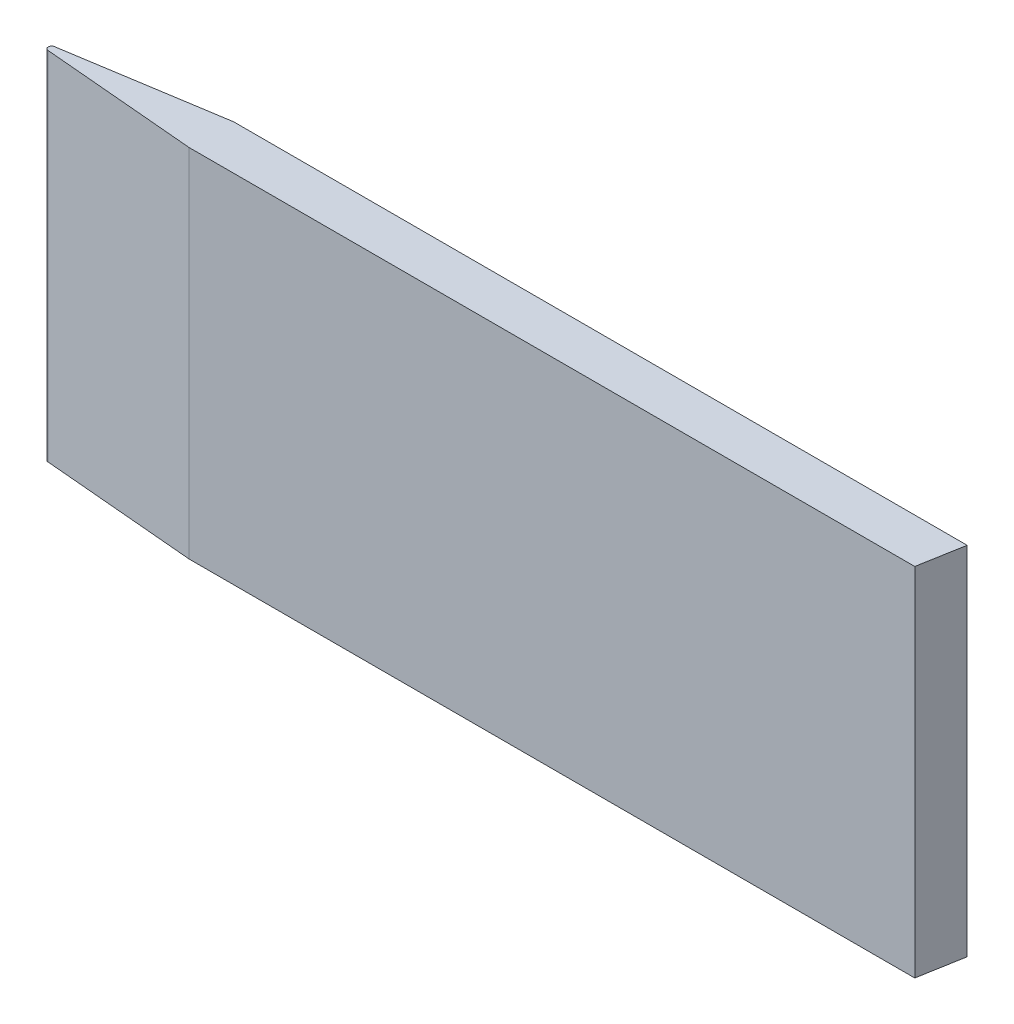
ISO-10303-21;
HEADER;
FILE_DESCRIPTION(('STEP AP214'),'2;1');
FILE_NAME('part.step','',(''),(''),'','','');
FILE_SCHEMA(('AUTOMOTIVE_DESIGN { 1 0 10303 214 1 1 1 1 }'));
ENDSEC;
DATA;
#1=APPLICATION_CONTEXT('core data for automotive mechanical design processes');
#2=APPLICATION_PROTOCOL_DEFINITION('international standard','automotive_design',2000,#1);
#3=PRODUCT_CONTEXT('',#1,'mechanical');
#4=PRODUCT('Part','Part','',(#3));
#5=PRODUCT_RELATED_PRODUCT_CATEGORY('part','',(#4));
#6=PRODUCT_DEFINITION_FORMATION('','',#4);
#7=PRODUCT_DEFINITION_CONTEXT('part definition',#1,'design');
#8=PRODUCT_DEFINITION('design','',#6,#7);
#9=PRODUCT_DEFINITION_SHAPE('','',#8);
#10=(LENGTH_UNIT() NAMED_UNIT(*) SI_UNIT(.MILLI.,.METRE.));
#11=(NAMED_UNIT(*) PLANE_ANGLE_UNIT() SI_UNIT($,.RADIAN.));
#12=(NAMED_UNIT(*) SI_UNIT($,.STERADIAN.) SOLID_ANGLE_UNIT());
#13=UNCERTAINTY_MEASURE_WITH_UNIT(LENGTH_MEASURE(1.E-05),#10,'distance_accuracy_value','');
#14=(GEOMETRIC_REPRESENTATION_CONTEXT(3) GLOBAL_UNCERTAINTY_ASSIGNED_CONTEXT((#13)) GLOBAL_UNIT_ASSIGNED_CONTEXT((#10,
#11,#12)) REPRESENTATION_CONTEXT('',''));
#15=CARTESIAN_POINT('',(0.,0.,0.));
#16=DIRECTION('',(0.,0.,1.));
#17=DIRECTION('',(1.,0.,0.));
#18=AXIS2_PLACEMENT_3D('',#15,#16,#17);
#19=CARTESIAN_POINT('',(-64.6455959706433,80.,-5.));
#20=DIRECTION('',(0.,0.,1.));
#21=DIRECTION('',(1.,0.,0.));
#22=AXIS2_PLACEMENT_3D('',#19,#20,#21);
#23=PLANE('',#22);
#24=DIRECTION('',(-1.,0.,0.));
#25=VECTOR('',#24,1.);
#26=CARTESIAN_POINT('',(-64.6455959706433,0.,-5.));
#27=LINE('',#26,#25);
#28=CARTESIAN_POINT('',(100.,0.,-5.));
#29=VERTEX_POINT('',#28);
#30=CARTESIAN_POINT('',(-64.6455959706433,0.,-5.));
#31=VERTEX_POINT('',#30);
#32=EDGE_CURVE('E129',#29,#31,#27,.T.);
#33=ORIENTED_EDGE('',*,*,#32,.T.);
#34=DIRECTION('',(0.,-1.,0.));
#35=VECTOR('',#34,1.);
#36=CARTESIAN_POINT('',(-64.6455959706433,80.,-5.));
#37=LINE('',#36,#35);
#38=CARTESIAN_POINT('',(-64.6455959706433,80.,-5.));
#39=VERTEX_POINT('',#38);
#40=EDGE_CURVE('E11',#39,#31,#37,.T.);
#41=ORIENTED_EDGE('',*,*,#40,.F.);
#42=DIRECTION('',(-1.,0.,0.));
#43=VECTOR('',#42,1.);
#44=CARTESIAN_POINT('',(-64.6455959706433,80.,-5.));
#45=LINE('',#44,#43);
#46=CARTESIAN_POINT('',(100.,80.,-5.));
#47=VERTEX_POINT('',#46);
#48=EDGE_CURVE('E143',#47,#39,#45,.T.);
#49=ORIENTED_EDGE('',*,*,#48,.F.);
#50=DIRECTION('',(0.,-1.,0.));
#51=VECTOR('',#50,1.);
#52=CARTESIAN_POINT('',(100.,80.,-5.));
#53=LINE('',#52,#51);
#54=EDGE_CURVE('E125',#47,#29,#53,.T.);
#55=ORIENTED_EDGE('',*,*,#54,.T.);
#56=EDGE_LOOP('',(#33,#41,#49,#55));
#57=FACE_BOUND('',#56,.T.);
#58=ADVANCED_FACE('F33',(#57),#23,.F.);
#59=CARTESIAN_POINT('',(-99.4516824022761,80.,0.512742519361473));
#60=DIRECTION('',(0.156434465040228,0.,0.987688340595138));
#61=DIRECTION('',(0.987688340595138,0.,-0.156434465040228));
#62=AXIS2_PLACEMENT_3D('',#59,#60,#61);
#63=PLANE('',#62);
#64=DIRECTION('',(-0.987688340595138,0.,0.156434465040228));
#65=VECTOR('',#64,1.);
#66=CARTESIAN_POINT('',(-99.4516824022761,0.,0.512742519361473));
#67=LINE('',#66,#65);
#68=CARTESIAN_POINT('',(-99.4516824022761,0.,0.512742519361474));
#69=VERTEX_POINT('',#68);
#70=EDGE_CURVE('E132',#31,#69,#67,.T.);
#71=ORIENTED_EDGE('',*,*,#70,.T.);
#72=DIRECTION('',(0.,-1.,0.));
#73=VECTOR('',#72,1.);
#74=CARTESIAN_POINT('',(-99.4516824022761,80.,0.512742519361474));
#75=LINE('',#74,#73);
#76=CARTESIAN_POINT('',(-99.4516824022761,80.,0.512742519361474));
#77=VERTEX_POINT('',#76);
#78=EDGE_CURVE('E41',#77,#69,#75,.T.);
#79=ORIENTED_EDGE('',*,*,#78,.F.);
#80=DIRECTION('',(-0.987688340595138,0.,0.156434465040228));
#81=VECTOR('',#80,1.);
#82=CARTESIAN_POINT('',(-99.4516824022761,80.,0.512742519361473));
#83=LINE('',#82,#81);
#84=EDGE_CURVE('E92',#39,#77,#83,.T.);
#85=ORIENTED_EDGE('',*,*,#84,.F.);
#86=ORIENTED_EDGE('',*,*,#40,.T.);
#87=EDGE_LOOP('',(#71,#79,#85,#86));
#88=FACE_BOUND('',#87,.T.);
#89=ADVANCED_FACE('F178',(#88),#63,.F.);
#90=CARTESIAN_POINT('',(-99.3499999999999,80.,1.15473994074831));
#91=DIRECTION('',(0.,-1.,0.));
#92=DIRECTION('',(0.,0.,-1.));
#93=AXIS2_PLACEMENT_3D('',#90,#91,#92);
#94=CYLINDRICAL_SURFACE('',#93,0.649999999999999);
#95=CARTESIAN_POINT('',(-99.3499999999999,0.,1.15473994074831));
#96=DIRECTION('',(0.,1.,0.));
#97=DIRECTION('',(0.,0.,1.));
#98=AXIS2_PLACEMENT_3D('',#95,#96,#97);
#99=CIRCLE('',#98,0.649999999999999);
#100=CARTESIAN_POINT('',(-99.9999999999999,0.,1.15473994074832));
#101=VERTEX_POINT('',#100);
#102=EDGE_CURVE('E134',#69,#101,#99,.T.);
#103=ORIENTED_EDGE('',*,*,#102,.T.);
#104=DIRECTION('',(0.,-1.,0.));
#105=VECTOR('',#104,1.);
#106=CARTESIAN_POINT('',(-99.9999999999999,80.,1.15473994074832));
#107=LINE('',#106,#105);
#108=CARTESIAN_POINT('',(-99.9999999999999,80.,1.15473994074832));
#109=VERTEX_POINT('',#108);
#110=EDGE_CURVE('E150',#109,#101,#107,.T.);
#111=ORIENTED_EDGE('',*,*,#110,.F.);
#112=CARTESIAN_POINT('',(-99.3499999999999,80.,1.15473994074831));
#113=DIRECTION('',(0.,1.,0.));
#114=DIRECTION('',(0.,0.,1.));
#115=AXIS2_PLACEMENT_3D('',#112,#113,#114);
#116=CIRCLE('',#115,0.649999999999999);
#117=EDGE_CURVE('E158',#77,#109,#116,.T.);
#118=ORIENTED_EDGE('',*,*,#117,.F.);
#119=ORIENTED_EDGE('',*,*,#78,.T.);
#120=EDGE_LOOP('',(#103,#111,#118,#119));
#121=FACE_BOUND('',#120,.T.);
#122=ADVANCED_FACE('F156',(#121),#94,.T.);
#123=CARTESIAN_POINT('',(-99.9999999999999,80.,1.31127517860459));
#124=DIRECTION('',(1.,0.,0.));
#125=DIRECTION('',(0.,0.,-1.));
#126=AXIS2_PLACEMENT_3D('',#123,#124,#125);
#127=PLANE('',#126);
#128=DIRECTION('',(0.,0.,1.));
#129=VECTOR('',#128,1.);
#130=CARTESIAN_POINT('',(-99.9999999999999,0.,1.31127517860459));
#131=LINE('',#130,#129);
#132=CARTESIAN_POINT('',(-99.9999999999999,0.,1.31127517860459));
#133=VERTEX_POINT('',#132);
#134=EDGE_CURVE('E136',#101,#133,#131,.T.);
#135=ORIENTED_EDGE('',*,*,#134,.T.);
#136=DIRECTION('',(0.,-1.,0.));
#137=VECTOR('',#136,1.);
#138=CARTESIAN_POINT('',(-99.9999999999999,80.,1.31127517860459));
#139=LINE('',#138,#137);
#140=CARTESIAN_POINT('',(-99.9999999999999,80.,1.31127517860459));
#141=VERTEX_POINT('',#140);
#142=EDGE_CURVE('E147',#141,#133,#139,.T.);
#143=ORIENTED_EDGE('',*,*,#142,.F.);
#144=DIRECTION('',(0.,0.,1.));
#145=VECTOR('',#144,1.);
#146=CARTESIAN_POINT('',(-99.9999999999999,80.,1.31127517860459));
#147=LINE('',#146,#145);
#148=EDGE_CURVE('E170',#109,#141,#147,.T.);
#149=ORIENTED_EDGE('',*,*,#148,.F.);
#150=ORIENTED_EDGE('',*,*,#110,.T.);
#151=EDGE_LOOP('',(#135,#143,#149,#150));
#152=FACE_BOUND('',#151,.T.);
#153=ADVANCED_FACE('F166',(#152),#127,.F.);
#154=CARTESIAN_POINT('',(-99.3499999999999,80.,1.31127517860459));
#155=DIRECTION('',(0.,-1.,0.));
#156=DIRECTION('',(0.,0.,-1.));
#157=AXIS2_PLACEMENT_3D('',#154,#155,#156);
#158=CYLINDRICAL_SURFACE('',#157,0.649999999999999);
#159=CARTESIAN_POINT('',(-99.3499999999999,0.,1.31127517860459));
#160=DIRECTION('',(0.,1.,0.));
#161=DIRECTION('',(0.,0.,-1.));
#162=AXIS2_PLACEMENT_3D('',#159,#160,#161);
#163=CIRCLE('',#162,0.649999999999999);
#164=CARTESIAN_POINT('',(-99.4066512327859,0.,1.95880173236423));
#165=VERTEX_POINT('',#164);
#166=EDGE_CURVE('E138',#133,#165,#163,.T.);
#167=ORIENTED_EDGE('',*,*,#166,.T.);
#168=DIRECTION('',(0.,-1.,0.));
#169=VECTOR('',#168,1.);
#170=CARTESIAN_POINT('',(-99.4066512327859,80.,1.95880173236423));
#171=LINE('',#170,#169);
#172=CARTESIAN_POINT('',(-99.4066512327859,80.,1.95880173236423));
#173=VERTEX_POINT('',#172);
#174=EDGE_CURVE('E120',#173,#165,#171,.T.);
#175=ORIENTED_EDGE('',*,*,#174,.F.);
#176=CARTESIAN_POINT('',(-99.3499999999999,80.,1.31127517860459));
#177=DIRECTION('',(0.,1.,0.));
#178=DIRECTION('',(0.,0.,-1.));
#179=AXIS2_PLACEMENT_3D('',#176,#177,#178);
#180=CIRCLE('',#179,0.649999999999999);
#181=EDGE_CURVE('E111',#141,#173,#180,.T.);
#182=ORIENTED_EDGE('',*,*,#181,.F.);
#183=ORIENTED_EDGE('',*,*,#142,.T.);
#184=EDGE_LOOP('',(#167,#175,#182,#183));
#185=FACE_BOUND('',#184,.T.);
#186=ADVANCED_FACE('F169',(#185),#158,.T.);
#187=CARTESIAN_POINT('',(-99.4066512327859,80.,1.95880173236423));
#188=DIRECTION('',(0.087155742747662,0.,-0.996194698091745));
#189=DIRECTION('',(-0.996194698091745,0.,-0.087155742747662));
#190=AXIS2_PLACEMENT_3D('',#187,#188,#189);
#191=PLANE('',#190);
#192=DIRECTION('',(0.996194698091745,0.,0.087155742747662));
#193=VECTOR('',#192,1.);
#194=CARTESIAN_POINT('',(-99.4066512327859,0.,1.95880173236423));
#195=LINE('',#194,#193);
#196=CARTESIAN_POINT('',(-64.6455959706433,0.,5.));
#197=VERTEX_POINT('',#196);
#198=EDGE_CURVE('E119',#165,#197,#195,.T.);
#199=ORIENTED_EDGE('',*,*,#198,.T.);
#200=DIRECTION('',(0.,-1.,0.));
#201=VECTOR('',#200,1.);
#202=CARTESIAN_POINT('',(-64.6455959706433,80.,5.));
#203=LINE('',#202,#201);
#204=CARTESIAN_POINT('',(-64.6455959706433,80.,5.));
#205=VERTEX_POINT('',#204);
#206=EDGE_CURVE('E116',#205,#197,#203,.T.);
#207=ORIENTED_EDGE('',*,*,#206,.F.);
#208=DIRECTION('',(0.996194698091745,0.,0.087155742747662));
#209=VECTOR('',#208,1.);
#210=CARTESIAN_POINT('',(-99.4066512327859,80.,1.95880173236423));
#211=LINE('',#210,#209);
#212=EDGE_CURVE('E105',#173,#205,#211,.T.);
#213=ORIENTED_EDGE('',*,*,#212,.F.);
#214=ORIENTED_EDGE('',*,*,#174,.T.);
#215=EDGE_LOOP('',(#199,#207,#213,#214));
#216=FACE_BOUND('',#215,.T.);
#217=ADVANCED_FACE('F117',(#216),#191,.F.);
#218=CARTESIAN_POINT('',(-64.6455959706433,80.,5.));
#219=DIRECTION('',(0.,0.,-1.));
#220=DIRECTION('',(-1.,0.,0.));
#221=AXIS2_PLACEMENT_3D('',#218,#219,#220);
#222=PLANE('',#221);
#223=DIRECTION('',(1.,0.,0.));
#224=VECTOR('',#223,1.);
#225=CARTESIAN_POINT('',(-64.6455959706433,0.,5.));
#226=LINE('',#225,#224);
#227=CARTESIAN_POINT('',(98.2367301929155,0.,5.));
#228=VERTEX_POINT('',#227);
#229=EDGE_CURVE('E78',#197,#228,#226,.T.);
#230=ORIENTED_EDGE('',*,*,#229,.T.);
#231=DIRECTION('',(0.,-1.,0.));
#232=VECTOR('',#231,1.);
#233=CARTESIAN_POINT('',(98.2367301929155,80.,5.));
#234=LINE('',#233,#232);
#235=CARTESIAN_POINT('',(98.2367301929155,80.,5.));
#236=VERTEX_POINT('',#235);
#237=EDGE_CURVE('E121',#236,#228,#234,.T.);
#238=ORIENTED_EDGE('',*,*,#237,.F.);
#239=DIRECTION('',(1.,0.,0.));
#240=VECTOR('',#239,1.);
#241=CARTESIAN_POINT('',(-64.6455959706433,80.,5.));
#242=LINE('',#241,#240);
#243=EDGE_CURVE('E109',#205,#236,#242,.T.);
#244=ORIENTED_EDGE('',*,*,#243,.F.);
#245=ORIENTED_EDGE('',*,*,#206,.T.);
#246=EDGE_LOOP('',(#230,#238,#244,#245));
#247=FACE_BOUND('',#246,.T.);
#248=ADVANCED_FACE('F123',(#247),#222,.F.);
#249=CARTESIAN_POINT('',(100.,80.,-5.));
#250=DIRECTION('',(-0.984807753012209,0.,-0.173648177666923));
#251=DIRECTION('',(-0.173648177666923,0.,0.984807753012209));
#252=AXIS2_PLACEMENT_3D('',#249,#250,#251);
#253=PLANE('',#252);
#254=DIRECTION('',(0.173648177666923,0.,-0.984807753012209));
#255=VECTOR('',#254,1.);
#256=CARTESIAN_POINT('',(100.,0.,-5.));
#257=LINE('',#256,#255);
#258=EDGE_CURVE('E84',#228,#29,#257,.T.);
#259=ORIENTED_EDGE('',*,*,#258,.T.);
#260=ORIENTED_EDGE('',*,*,#54,.F.);
#261=DIRECTION('',(0.173648177666923,0.,-0.984807753012209));
#262=VECTOR('',#261,1.);
#263=CARTESIAN_POINT('',(100.,80.,-5.));
#264=LINE('',#263,#262);
#265=EDGE_CURVE('E49',#236,#47,#264,.T.);
#266=ORIENTED_EDGE('',*,*,#265,.F.);
#267=ORIENTED_EDGE('',*,*,#237,.T.);
#268=EDGE_LOOP('',(#259,#260,#266,#267));
#269=FACE_BOUND('',#268,.T.);
#270=ADVANCED_FACE('F194',(#269),#253,.F.);
#271=CARTESIAN_POINT('',(-99.3499999999999,80.,1.31127517860459));
#272=DIRECTION('',(0.,-1.,0.));
#273=DIRECTION('',(0.,0.,-1.));
#274=AXIS2_PLACEMENT_3D('',#271,#272,#273);
#275=PLANE('',#274);
#276=ORIENTED_EDGE('',*,*,#48,.T.);
#277=ORIENTED_EDGE('',*,*,#84,.T.);
#278=ORIENTED_EDGE('',*,*,#117,.T.);
#279=ORIENTED_EDGE('',*,*,#148,.T.);
#280=ORIENTED_EDGE('',*,*,#181,.T.);
#281=ORIENTED_EDGE('',*,*,#212,.T.);
#282=ORIENTED_EDGE('',*,*,#243,.T.);
#283=ORIENTED_EDGE('',*,*,#265,.T.);
#284=EDGE_LOOP('',(#276,#277,#278,#279,#280,#281,#282,#283));
#285=FACE_BOUND('',#284,.T.);
#286=ADVANCED_FACE('F107',(#285),#275,.F.);
#287=CARTESIAN_POINT('',(-99.3499999999999,0.,1.31127517860459));
#288=DIRECTION('',(0.,-1.,0.));
#289=DIRECTION('',(0.,0.,-1.));
#290=AXIS2_PLACEMENT_3D('',#287,#288,#289);
#291=PLANE('',#290);
#292=ORIENTED_EDGE('',*,*,#32,.F.);
#293=ORIENTED_EDGE('',*,*,#258,.F.);
#294=ORIENTED_EDGE('',*,*,#229,.F.);
#295=ORIENTED_EDGE('',*,*,#198,.F.);
#296=ORIENTED_EDGE('',*,*,#166,.F.);
#297=ORIENTED_EDGE('',*,*,#134,.F.);
#298=ORIENTED_EDGE('',*,*,#102,.F.);
#299=ORIENTED_EDGE('',*,*,#70,.F.);
#300=EDGE_LOOP('',(#292,#293,#294,#295,#296,#297,#298,#299));
#301=FACE_BOUND('',#300,.T.);
#302=ADVANCED_FACE('F162',(#301),#291,.T.);
#303=CLOSED_SHELL('',(#58,#89,#122,#153,#186,#217,#248,#270,#286,#302));
#304=MANIFOLD_SOLID_BREP('B2',#303);
#305=ADVANCED_BREP_SHAPE_REPRESENTATION('',(#18,#304),#14);
#306=SHAPE_DEFINITION_REPRESENTATION(#9,#305);
ENDSEC;
END-ISO-10303-21;
